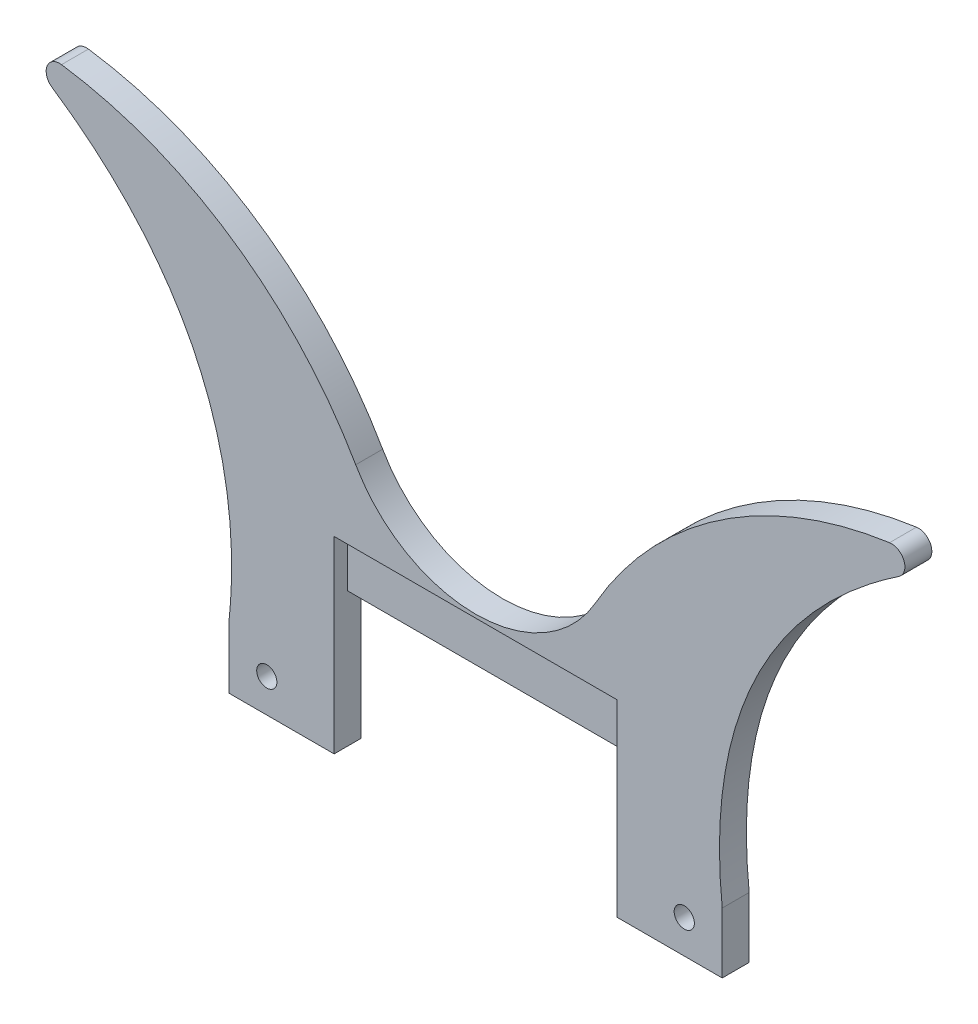
ISO-10303-21;
HEADER;
FILE_DESCRIPTION(('STEP AP214'),'2;1');
FILE_NAME('part.step','',(''),(''),'','','');
FILE_SCHEMA(('AUTOMOTIVE_DESIGN { 1 0 10303 214 1 1 1 1 }'));
ENDSEC;
DATA;
#1=APPLICATION_CONTEXT('core data for automotive mechanical design processes');
#2=APPLICATION_PROTOCOL_DEFINITION('international standard','automotive_design',2000,#1);
#3=PRODUCT_CONTEXT('',#1,'mechanical');
#4=PRODUCT('Part','Part','',(#3));
#5=PRODUCT_RELATED_PRODUCT_CATEGORY('part','',(#4));
#6=PRODUCT_DEFINITION_FORMATION('','',#4);
#7=PRODUCT_DEFINITION_CONTEXT('part definition',#1,'design');
#8=PRODUCT_DEFINITION('design','',#6,#7);
#9=PRODUCT_DEFINITION_SHAPE('','',#8);
#10=(LENGTH_UNIT() NAMED_UNIT(*) SI_UNIT(.MILLI.,.METRE.));
#11=(NAMED_UNIT(*) PLANE_ANGLE_UNIT() SI_UNIT($,.RADIAN.));
#12=(NAMED_UNIT(*) SI_UNIT($,.STERADIAN.) SOLID_ANGLE_UNIT());
#13=UNCERTAINTY_MEASURE_WITH_UNIT(LENGTH_MEASURE(1.E-05),#10,'distance_accuracy_value','');
#14=(GEOMETRIC_REPRESENTATION_CONTEXT(3) GLOBAL_UNCERTAINTY_ASSIGNED_CONTEXT((#13)) GLOBAL_UNIT_ASSIGNED_CONTEXT((#10,
#11,#12)) REPRESENTATION_CONTEXT('',''));
#15=CARTESIAN_POINT('',(0.,0.,0.));
#16=DIRECTION('',(0.,0.,1.));
#17=DIRECTION('',(1.,0.,0.));
#18=AXIS2_PLACEMENT_3D('',#15,#16,#17);
#19=CARTESIAN_POINT('',(21.,-29.,3.));
#20=DIRECTION('',(0.,1.,0.));
#21=DIRECTION('',(0.,0.,1.));
#22=AXIS2_PLACEMENT_3D('',#19,#20,#21);
#23=PLANE('',#22);
#24=DIRECTION('',(1.,0.,0.));
#25=VECTOR('',#24,1.);
#26=CARTESIAN_POINT('',(-21.,-29.,2.));
#27=LINE('',#26,#25);
#28=CARTESIAN_POINT('',(-21.,-29.,2.));
#29=VERTEX_POINT('',#28);
#30=CARTESIAN_POINT('',(21.,-29.,2.));
#31=VERTEX_POINT('',#30);
#32=EDGE_CURVE('E174',#29,#31,#27,.T.);
#33=ORIENTED_EDGE('',*,*,#32,.F.);
#34=DIRECTION('',(0.,0.,-1.));
#35=VECTOR('',#34,1.);
#36=CARTESIAN_POINT('',(-21.,-29.,3.));
#37=LINE('',#36,#35);
#38=CARTESIAN_POINT('',(-21.,-29.,0.));
#39=VERTEX_POINT('',#38);
#40=EDGE_CURVE('E171',#29,#39,#37,.T.);
#41=ORIENTED_EDGE('',*,*,#40,.T.);
#42=DIRECTION('',(1.,0.,0.));
#43=VECTOR('',#42,1.);
#44=CARTESIAN_POINT('',(21.,-29.,0.));
#45=LINE('',#44,#43);
#46=CARTESIAN_POINT('',(21.,-29.,0.));
#47=VERTEX_POINT('',#46);
#48=EDGE_CURVE('E354',#39,#47,#45,.T.);
#49=ORIENTED_EDGE('',*,*,#48,.T.);
#50=DIRECTION('',(0.,0.,-1.));
#51=VECTOR('',#50,1.);
#52=CARTESIAN_POINT('',(21.,-29.,3.));
#53=LINE('',#52,#51);
#54=EDGE_CURVE('E41',#31,#47,#53,.T.);
#55=ORIENTED_EDGE('',*,*,#54,.F.);
#56=EDGE_LOOP('',(#33,#41,#49,#55));
#57=FACE_BOUND('',#56,.T.);
#58=ADVANCED_FACE('F35',(#57),#23,.F.);
#59=CARTESIAN_POINT('',(-62.8789501729244,15.7957748257768,3.));
#60=CARTESIAN_POINT('',(-43.1395929849563,2.52766463737963,3.));
#61=CARTESIAN_POINT('',(-34.1215450972328,-16.7044066047716,3.));
#62=CARTESIAN_POINT('',(-36.6359205884375,-39.9745318361721,3.));
#63=B_SPLINE_CURVE_WITH_KNOTS('',3,(#59,#60,#61,#62),.UNSPECIFIED.,.F.,.F.,(4,4),(0.,
0.899908390048504),.UNSPECIFIED.);
#64=DIRECTION('',(0.,0.,-1.));
#65=VECTOR('',#64,1.);
#66=SURFACE_OF_LINEAR_EXTRUSION('',#63,#65);
#67=CARTESIAN_POINT('',(-62.8789501729244,15.7957748257768,0.));
#68=CARTESIAN_POINT('',(-43.1395929849563,2.52766463737963,0.));
#69=CARTESIAN_POINT('',(-34.1215450972328,-16.7044066047716,0.));
#70=CARTESIAN_POINT('',(-36.6359205884375,-39.9745318361721,0.));
#71=B_SPLINE_CURVE_WITH_KNOTS('',3,(#67,#68,#69,#70),.UNSPECIFIED.,.F.,.F.,(4,4),(0.,
0.899908390048504),.UNSPECIFIED.);
#72=CARTESIAN_POINT('',(-62.8789501729244,15.7957748257768,0.));
#73=VERTEX_POINT('',#72);
#74=CARTESIAN_POINT('',(-36.6359205884375,-39.9745318361721,0.));
#75=VERTEX_POINT('',#74);
#76=EDGE_CURVE('E310',#73,#75,#71,.T.);
#77=ORIENTED_EDGE('',*,*,#76,.T.);
#78=DIRECTION('',(0.,0.,-1.));
#79=VECTOR('',#78,1.);
#80=CARTESIAN_POINT('',(-36.6359205884375,-39.9745318361721,3.));
#81=LINE('',#80,#79);
#82=CARTESIAN_POINT('',(-36.6359205884375,-39.9745318361721,4.));
#83=VERTEX_POINT('',#82);
#84=EDGE_CURVE('E11',#83,#75,#81,.T.);
#85=ORIENTED_EDGE('',*,*,#84,.F.);
#86=CARTESIAN_POINT('',(-62.8789501983524,15.7957748428687,4.));
#87=CARTESIAN_POINT('',(-62.2992047153579,15.4060908624896,4.));
#88=CARTESIAN_POINT('',(-61.7247011820654,15.0085678996703,4.));
#89=CARTESIAN_POINT('',(-60.5863572690888,14.197069828261,4.));
#90=CARTESIAN_POINT('',(-60.0225310732882,13.7830748302125,4.));
#91=CARTESIAN_POINT('',(-58.9067497613757,12.9385098967699,4.));
#92=CARTESIAN_POINT('',(-58.3548039293089,12.5079276833045,4.));
#93=CARTESIAN_POINT('',(-57.2639786820871,11.6301095438679,4.));
#94=CARTESIAN_POINT('',(-56.7251040863667,11.1828676249731,4.));
#95=CARTESIAN_POINT('',(-55.6615856510737,10.2716850328772,4.));
#96=CARTESIAN_POINT('',(-55.136942827,9.80774317352995,4.));
#97=CARTESIAN_POINT('',(-54.1002857898766,8.86065395224623,4.));
#98=CARTESIAN_POINT('',(-53.5883509303149,8.3774196662437,4.));
#99=CARTESIAN_POINT('',(-52.5811482155379,7.39412188527395,4.));
#100=CARTESIAN_POINT('',(-52.0858761753551,6.89406268005182,4.));
#101=CARTESIAN_POINT('',(-51.1130819458684,5.87719780860403,4.));
#102=CARTESIAN_POINT('',(-50.6355553308735,5.36039637887713,4.));
#103=CARTESIAN_POINT('',(-49.699288198195,4.31016741537,4.));
#104=CARTESIAN_POINT('',(-49.240544980498,3.77674229070856,4.));
#105=CARTESIAN_POINT('',(-48.3428430793594,2.69344388811653,4.));
#106=CARTESIAN_POINT('',(-47.903885630509,2.14356958734303,4.));
#107=CARTESIAN_POINT('',(-46.9349167875511,0.882045796105658,4.));
#108=CARTESIAN_POINT('',(-46.4110629279017,0.16564947165594,4.));
#109=CARTESIAN_POINT('',(-45.3985077794996,-1.29178835244538,4.));
#110=CARTESIAN_POINT('',(-44.9098137511878,-2.03283489638598,4.));
#111=CARTESIAN_POINT('',(-43.9695336637035,-3.5381635301475,4.));
#112=CARTESIAN_POINT('',(-43.5179489543933,-4.30244646381471,4.));
#113=CARTESIAN_POINT('',(-42.653549136021,-5.85262541019528,4.));
#114=CARTESIAN_POINT('',(-42.2407335077328,-6.63852113327074,4.));
#115=CARTESIAN_POINT('',(-41.4566207304155,-8.22724888817084,4.));
#116=CARTESIAN_POINT('',(-41.0851796613498,-9.03000987917214,4.));
#117=CARTESIAN_POINT('',(-40.3831078266692,-10.6532082008548,4.));
#118=CARTESIAN_POINT('',(-40.0524781214374,-11.4736459901741,4.));
#119=CARTESIAN_POINT('',(-39.4327057047415,-13.1299768196811,4.));
#120=CARTESIAN_POINT('',(-39.1435603919995,-13.9658688870948,4.));
#121=CARTESIAN_POINT('',(-38.6070628595533,-15.6507681952899,4.));
#122=CARTESIAN_POINT('',(-38.3597019188835,-16.4997726588624,4.));
#123=CARTESIAN_POINT('',(-37.9403137285905,-18.0816850370489,4.));
#124=CARTESIAN_POINT('',(-37.7625538954137,-18.8130811001312,4.));
#125=CARTESIAN_POINT('',(-37.4369360785479,-20.282557797616,4.));
#126=CARTESIAN_POINT('',(-37.2890804373485,-21.020638950955,4.));
#127=CARTESIAN_POINT('',(-37.0228985260351,-22.5020090107033,4.));
#128=CARTESIAN_POINT('',(-36.9045685831705,-23.2452972575563,4.));
#129=CARTESIAN_POINT('',(-36.696846188067,-24.7359271716299,4.));
#130=CARTESIAN_POINT('',(-36.6074561715297,-25.4832691746518,4.));
#131=CARTESIAN_POINT('',(-36.381609041228,-27.7306742750706,4.));
#132=CARTESIAN_POINT('',(-36.2876412861376,-29.2351784920014,4.));
#133=CARTESIAN_POINT('',(-36.2064938502323,-32.2464275421835,4.));
#134=CARTESIAN_POINT('',(-36.2192865389033,-33.7531716947938,4.));
#135=CARTESIAN_POINT('',(-36.314292657224,-36.0465312373141,4.));
#136=CARTESIAN_POINT('',(-36.3605953895022,-36.8348165574061,4.));
#137=CARTESIAN_POINT('',(-36.4791458520079,-38.4073486103966,4.));
#138=CARTESIAN_POINT('',(-36.5513248235576,-39.1916005114055,4.));
#139=CARTESIAN_POINT('',(-36.6359205884375,-39.9745318361721,4.));
#140=B_SPLINE_CURVE_WITH_KNOTS('',3,(#86,#87,#88,#89,#90,#91,#92,#93,#94,#95,#96,#97,#98,#99,
#100,#101,#102,#103,#104,#105,#106,#107,#108,#109,#110,#111,#112,#113,#114,#115,#116,#117,#118,
#119,#120,#121,#122,#123,#124,#125,#126,#127,#128,#129,#130,#131,#132,#133,#134,#135,#136,#137,
#138,#139),.UNSPECIFIED.,.F.,.F.,(4,2,2,2,2,2,2,2,2,2,2,2,2,2,2,2,2,2,2,2,2,2,2,2,2,2,4),(0.,
2.0955903971612,4.19379288201894,6.29357950728328,8.39412891576521,10.4948278154304,
12.6063920340987,14.7174219003939,16.8279216954029,18.9381170445707,21.0484438838138,
23.7098775635535,26.3718592564134,29.033937736806,31.6959805594471,34.3484535906611,
37.0009955253802,39.6533710597453,42.3051923214926,44.5626394568548,46.8202633567307,
49.077606286863,51.3351391547758,55.8530551850305,60.3698019763224,62.7383537594367,
65.1006578862477),.UNSPECIFIED.);
#141=CARTESIAN_POINT('',(-62.8789501983524,15.7957748428687,4.));
#142=VERTEX_POINT('',#141);
#143=EDGE_CURVE('E216',#142,#83,#140,.T.);
#144=ORIENTED_EDGE('',*,*,#143,.F.);
#145=DIRECTION('',(0.,0.,-1.));
#146=VECTOR('',#145,1.);
#147=CARTESIAN_POINT('',(-62.8789501729244,15.7957748257768,3.));
#148=LINE('',#147,#146);
#149=EDGE_CURVE('E336',#142,#73,#148,.T.);
#150=ORIENTED_EDGE('',*,*,#149,.T.);
#151=EDGE_LOOP('',(#77,#85,#144,#150));
#152=FACE_BOUND('',#151,.T.);
#153=ADVANCED_FACE('F37',(#152),#66,.F.);
#154=CARTESIAN_POINT('',(36.6359205884375,-39.9745318361721,3.));
#155=CARTESIAN_POINT('',(34.1215450972952,-16.7044066048686,3.));
#156=CARTESIAN_POINT('',(43.1395929848827,2.52766463747982,3.));
#157=CARTESIAN_POINT('',(62.8789501729157,15.795774825771,3.));
#158=B_SPLINE_CURVE_WITH_KNOTS('',3,(#154,#155,#156,#157),.UNSPECIFIED.,.F.,.F.,(4,4),(0.,
0.899908390048373),.UNSPECIFIED.);
#159=DIRECTION('',(0.,0.,-1.));
#160=VECTOR('',#159,1.);
#161=SURFACE_OF_LINEAR_EXTRUSION('',#158,#160);
#162=CARTESIAN_POINT('',(36.6359205884375,-39.9745318361721,0.));
#163=CARTESIAN_POINT('',(34.1215450972952,-16.7044066048686,0.));
#164=CARTESIAN_POINT('',(43.1395929848827,2.52766463747982,0.));
#165=CARTESIAN_POINT('',(62.8789501729157,15.795774825771,0.));
#166=B_SPLINE_CURVE_WITH_KNOTS('',3,(#162,#163,#164,#165),.UNSPECIFIED.,.F.,.F.,(4,4),(0.,
0.899908390048373),.UNSPECIFIED.);
#167=CARTESIAN_POINT('',(36.6359205884375,-39.9745318361721,0.));
#168=VERTEX_POINT('',#167);
#169=CARTESIAN_POINT('',(62.8789501729157,15.795774825771,0.));
#170=VERTEX_POINT('',#169);
#171=EDGE_CURVE('E318',#168,#170,#166,.T.);
#172=ORIENTED_EDGE('',*,*,#171,.T.);
#173=DIRECTION('',(0.,0.,-1.));
#174=VECTOR('',#173,1.);
#175=CARTESIAN_POINT('',(62.8789501729157,15.795774825771,3.));
#176=LINE('',#175,#174);
#177=CARTESIAN_POINT('',(62.8789501729157,15.795774825771,4.));
#178=VERTEX_POINT('',#177);
#179=EDGE_CURVE('E348',#178,#170,#176,.T.);
#180=ORIENTED_EDGE('',*,*,#179,.F.);
#181=CARTESIAN_POINT('',(36.6359205884375,-39.9745318361721,4.));
#182=CARTESIAN_POINT('',(36.5629554677317,-39.2992680081986,4.));
#183=CARTESIAN_POINT('',(36.4992274072153,-38.622984757228,4.));
#184=CARTESIAN_POINT('',(36.3909092968743,-37.268111644364,4.));
#185=CARTESIAN_POINT('',(36.3463412320639,-36.58952002848,4.));
#186=CARTESIAN_POINT('',(36.2771535449611,-35.2308426823181,4.));
#187=CARTESIAN_POINT('',(36.2525476794966,-34.5507562449832,4.));
#188=CARTESIAN_POINT('',(36.2240477972191,-33.1899197372069,4.));
#189=CARTESIAN_POINT('',(36.2201605837493,-32.5091695221847,4.));
#190=CARTESIAN_POINT('',(36.2338124534101,-31.1478341500348,4.));
#191=CARTESIAN_POINT('',(36.2513528744646,-30.4672490058682,4.));
#192=CARTESIAN_POINT('',(36.3086330789313,-29.1044289893609,4.));
#193=CARTESIAN_POINT('',(36.3484565173289,-28.4221976042566,4.));
#194=CARTESIAN_POINT('',(36.450974517623,-27.0596091832346,4.));
#195=CARTESIAN_POINT('',(36.5136637026545,-26.3792517445243,4.));
#196=CARTESIAN_POINT('',(36.662461835899,-25.0212562526201,4.));
#197=CARTESIAN_POINT('',(36.7485653365755,-24.3436176040438,4.));
#198=CARTESIAN_POINT('',(36.9446781065149,-22.9918929547218,4.));
#199=CARTESIAN_POINT('',(37.0546841235846,-22.3178064834319,4.));
#200=CARTESIAN_POINT('',(37.2990161096672,-20.9740259848599,4.));
#201=CARTESIAN_POINT('',(37.4333432346668,-20.30433216793,4.));
#202=CARTESIAN_POINT('',(37.7647588733085,-18.7969158087323,4.));
#203=CARTESIAN_POINT('',(37.9690850441294,-17.9607717643407,4.));
#204=CARTESIAN_POINT('',(38.4172469084204,-16.2989697268659,4.));
#205=CARTESIAN_POINT('',(38.661090192519,-15.4733137813082,4.));
#206=CARTESIAN_POINT('',(39.188325846153,-13.8346768053953,4.));
#207=CARTESIAN_POINT('',(39.4717198439239,-13.0216962983989,4.));
#208=CARTESIAN_POINT('',(40.077770795431,-11.4105187580085,4.));
#209=CARTESIAN_POINT('',(40.4004269362143,-10.6123214189117,4.));
#210=CARTESIAN_POINT('',(41.0833561966707,-9.03508861246474,4.));
#211=CARTESIAN_POINT('',(41.4435110085324,-8.25600191939038,4.));
#212=CARTESIAN_POINT('',(42.2013426833512,-6.71628462680704,4.));
#213=CARTESIAN_POINT('',(42.5990201055576,-5.95565430259033,4.));
#214=CARTESIAN_POINT('',(43.4306677087596,-4.45455540809288,4.));
#215=CARTESIAN_POINT('',(43.8646362490711,-3.7140859283653,4.));
#216=CARTESIAN_POINT('',(44.7673509613336,-2.25483987274436,4.));
#217=CARTESIAN_POINT('',(45.2360910200989,-1.53605951479584,4.));
#218=CARTESIAN_POINT('',(46.1458149426853,-0.210076430628495,4.));
#219=CARTESIAN_POINT('',(46.5828991907427,0.39980813034508,4.));
#220=CARTESIAN_POINT('',(47.4812571689221,1.60156528035239,4.));
#221=CARTESIAN_POINT('',(47.9425328357944,2.1934364212297,4.));
#222=CARTESIAN_POINT('',(48.887911232869,3.35854117954806,4.));
#223=CARTESIAN_POINT('',(49.3720113367572,3.93177692852481,4.));
#224=CARTESIAN_POINT('',(50.3617788864925,5.05934372448881,4.));
#225=CARTESIAN_POINT('',(50.8674480718163,5.61367324023706,4.));
#226=CARTESIAN_POINT('',(52.4158427757139,7.24900549131061,4.));
#227=CARTESIAN_POINT('',(53.4891059446623,8.3013097336643,4.));
#228=CARTESIAN_POINT('',(55.7058085099433,10.3284097991378,4.));
#229=CARTESIAN_POINT('',(56.8492326864788,11.3032223276959,4.));
#230=CARTESIAN_POINT('',(58.4154263814602,12.5534933585002,4.));
#231=CARTESIAN_POINT('',(58.8115690166169,12.8627779773844,4.));
#232=CARTESIAN_POINT('',(59.6102224343737,13.472898404424,4.));
#233=CARTESIAN_POINT('',(60.012732116057,13.7737356487695,4.));
#234=CARTESIAN_POINT('',(60.8225353087744,14.3661469878053,4.));
#235=CARTESIAN_POINT('',(61.2298094952118,14.6577475388171,4.));
#236=CARTESIAN_POINT('',(62.0501379106521,15.2328332002011,4.));
#237=CARTESIAN_POINT('',(62.4631929782197,15.5163171146355,4.));
#238=CARTESIAN_POINT('',(62.8789501729157,15.795774825771,4.));
#239=B_SPLINE_CURVE_WITH_KNOTS('',3,(#181,#182,#183,#184,#185,#186,#187,#188,#189,#190,#191,
#192,#193,#194,#195,#196,#197,#198,#199,#200,#201,#202,#203,#204,#205,#206,#207,#208,#209,#210,
#211,#212,#213,#214,#215,#216,#217,#218,#219,#220,#221,#222,#223,#224,#225,#226,#227,#228,#229,
#230,#231,#232,#233,#234,#235,#236,#237,#238),.UNSPECIFIED.,.F.,.F.,(4,2,2,2,2,2,2,2,2,2,2,2,2,
2,2,2,2,2,2,2,2,2,2,2,2,2,2,2,4),(0.,2.03755132686895,4.07743442886864,6.11872211256235,
8.16068004860976,10.2027654893312,12.25256927456,14.3018913602204,16.3507370612891,
18.3993041693433,20.447968671737,23.0292252830187,25.6109783028819,28.1928376404816,
30.7746435277934,33.3485374407018,35.9224697218329,38.4962857009911,41.0696502447757,
43.3200505217677,45.5706312402864,47.8209536227543,50.071457830872,54.5764895089301,
59.0805473566836,60.5882167166257,62.0956281770586,63.5982375162388,65.1010671282741),.UNSPECIFIED.);
#240=CARTESIAN_POINT('',(36.6359205884375,-39.9745318361721,4.));
#241=VERTEX_POINT('',#240);
#242=EDGE_CURVE('E200',#241,#178,#239,.T.);
#243=ORIENTED_EDGE('',*,*,#242,.F.);
#244=DIRECTION('',(0.,0.,-1.));
#245=VECTOR('',#244,1.);
#246=CARTESIAN_POINT('',(36.6359205884375,-39.9745318361721,3.));
#247=LINE('',#246,#245);
#248=EDGE_CURVE('E47',#241,#168,#247,.T.);
#249=ORIENTED_EDGE('',*,*,#248,.T.);
#250=EDGE_LOOP('',(#172,#180,#243,#249));
#251=FACE_BOUND('',#250,.T.);
#252=ADVANCED_FACE('F296',(#251),#161,.F.);
#253=CARTESIAN_POINT('',(61.7632390949741,17.4556509628844,3.));
#254=DIRECTION('',(0.,0.,-1.));
#255=DIRECTION('',(-1.,0.,0.));
#256=AXIS2_PLACEMENT_3D('',#253,#254,#255);
#257=CYLINDRICAL_SURFACE('',#256,2.);
#258=CARTESIAN_POINT('',(61.7632390949741,17.4556509628844,0.));
#259=DIRECTION('',(0.,0.,1.));
#260=DIRECTION('',(1.,0.,0.));
#261=AXIS2_PLACEMENT_3D('',#258,#259,#260);
#262=CIRCLE('',#261,2.);
#263=CARTESIAN_POINT('',(61.4835796629155,19.4360020938863,0.));
#264=VERTEX_POINT('',#263);
#265=EDGE_CURVE('E325',#170,#264,#262,.T.);
#266=ORIENTED_EDGE('',*,*,#265,.T.);
#267=DIRECTION('',(0.,0.,-1.));
#268=VECTOR('',#267,1.);
#269=CARTESIAN_POINT('',(61.4835796629155,19.4360020938863,3.));
#270=LINE('',#269,#268);
#271=CARTESIAN_POINT('',(61.4835796629155,19.4360020938863,4.));
#272=VERTEX_POINT('',#271);
#273=EDGE_CURVE('E345',#272,#264,#270,.T.);
#274=ORIENTED_EDGE('',*,*,#273,.F.);
#275=CARTESIAN_POINT('',(61.7632390949741,17.4556509628844,4.));
#276=DIRECTION('',(0.,0.,1.));
#277=DIRECTION('',(1.,0.,0.));
#278=AXIS2_PLACEMENT_3D('',#275,#276,#277);
#279=CIRCLE('',#278,1.99999999999999);
#280=EDGE_CURVE('E201',#178,#272,#279,.T.);
#281=ORIENTED_EDGE('',*,*,#280,.F.);
#282=ORIENTED_EDGE('',*,*,#179,.T.);
#283=EDGE_LOOP('',(#266,#274,#281,#282));
#284=FACE_BOUND('',#283,.T.);
#285=ADVANCED_FACE('F293',(#284),#257,.T.);
#286=CARTESIAN_POINT('',(69.8733626246717,-39.9745318361721,3.));
#287=DIRECTION('',(0.,0.,-1.));
#288=DIRECTION('',(-1.,0.,0.));
#289=AXIS2_PLACEMENT_3D('',#286,#287,#288);
#290=CYLINDRICAL_SURFACE('',#289,60.);
#291=CARTESIAN_POINT('',(69.8733626246717,-39.9745318361721,0.));
#292=DIRECTION('',(0.,0.,1.));
#293=DIRECTION('',(1.,0.,0.));
#294=AXIS2_PLACEMENT_3D('',#291,#292,#293);
#295=CIRCLE('',#294,60.);
#296=CARTESIAN_POINT('',(17.7938376870282,-10.179849722255,0.));
#297=VERTEX_POINT('',#296);
#298=EDGE_CURVE('E330',#264,#297,#295,.T.);
#299=ORIENTED_EDGE('',*,*,#298,.T.);
#300=DIRECTION('',(0.,0.,-1.));
#301=VECTOR('',#300,1.);
#302=CARTESIAN_POINT('',(17.7938376870282,-10.179849722255,3.));
#303=LINE('',#302,#301);
#304=CARTESIAN_POINT('',(17.7938376870282,-10.179849722255,4.));
#305=VERTEX_POINT('',#304);
#306=EDGE_CURVE('E342',#305,#297,#303,.T.);
#307=ORIENTED_EDGE('',*,*,#306,.F.);
#308=CARTESIAN_POINT('',(69.8733626246717,-39.9745318361721,4.));
#309=DIRECTION('',(0.,0.,1.));
#310=DIRECTION('',(1.,0.,0.));
#311=AXIS2_PLACEMENT_3D('',#308,#309,#310);
#312=CIRCLE('',#311,60.);
#313=EDGE_CURVE('E204',#272,#305,#312,.T.);
#314=ORIENTED_EDGE('',*,*,#313,.F.);
#315=ORIENTED_EDGE('',*,*,#273,.T.);
#316=EDGE_LOOP('',(#299,#307,#314,#315));
#317=FACE_BOUND('',#316,.T.);
#318=ADVANCED_FACE('F289',(#317),#290,.T.);
#319=CARTESIAN_POINT('',(0.,0.,3.));
#320=DIRECTION('',(0.,0.,-1.));
#321=DIRECTION('',(-1.,0.,0.));
#322=AXIS2_PLACEMENT_3D('',#319,#320,#321);
#323=CYLINDRICAL_SURFACE('',#322,20.5);
#324=CARTESIAN_POINT('',(0.,0.,0.));
#325=DIRECTION('',(0.,0.,-1.));
#326=DIRECTION('',(1.,0.,0.));
#327=AXIS2_PLACEMENT_3D('',#324,#325,#326);
#328=CIRCLE('',#327,20.5);
#329=CARTESIAN_POINT('',(-17.7938376870282,-10.179849722255,0.));
#330=VERTEX_POINT('',#329);
#331=EDGE_CURVE('E332',#297,#330,#328,.T.);
#332=ORIENTED_EDGE('',*,*,#331,.T.);
#333=DIRECTION('',(0.,0.,-1.));
#334=VECTOR('',#333,1.);
#335=CARTESIAN_POINT('',(-17.7938376870282,-10.179849722255,3.));
#336=LINE('',#335,#334);
#337=CARTESIAN_POINT('',(-17.7938376870282,-10.179849722255,4.));
#338=VERTEX_POINT('',#337);
#339=EDGE_CURVE('E340',#338,#330,#336,.T.);
#340=ORIENTED_EDGE('',*,*,#339,.F.);
#341=CARTESIAN_POINT('',(0.,0.,4.));
#342=DIRECTION('',(0.,0.,-1.));
#343=DIRECTION('',(1.,0.,0.));
#344=AXIS2_PLACEMENT_3D('',#341,#342,#343);
#345=CIRCLE('',#344,20.5);
#346=EDGE_CURVE('E207',#305,#338,#345,.T.);
#347=ORIENTED_EDGE('',*,*,#346,.F.);
#348=ORIENTED_EDGE('',*,*,#306,.T.);
#349=EDGE_LOOP('',(#332,#340,#347,#348));
#350=FACE_BOUND('',#349,.T.);
#351=ADVANCED_FACE('F286',(#350),#323,.F.);
#352=CARTESIAN_POINT('',(-69.8733626246717,-39.9745318361721,3.));
#353=DIRECTION('',(0.,0.,-1.));
#354=DIRECTION('',(-1.,0.,0.));
#355=AXIS2_PLACEMENT_3D('',#352,#353,#354);
#356=CYLINDRICAL_SURFACE('',#355,60.);
#357=CARTESIAN_POINT('',(-69.8733626246717,-39.9745318361721,0.));
#358=DIRECTION('',(0.,0.,1.));
#359=DIRECTION('',(-1.,0.,0.));
#360=AXIS2_PLACEMENT_3D('',#357,#358,#359);
#361=CIRCLE('',#360,60.);
#362=CARTESIAN_POINT('',(-61.4835796629155,19.4360020938863,0.));
#363=VERTEX_POINT('',#362);
#364=EDGE_CURVE('E63',#330,#363,#361,.T.);
#365=ORIENTED_EDGE('',*,*,#364,.T.);
#366=DIRECTION('',(0.,0.,-1.));
#367=VECTOR('',#366,1.);
#368=CARTESIAN_POINT('',(-61.4835796629155,19.4360020938863,3.));
#369=LINE('',#368,#367);
#370=CARTESIAN_POINT('',(-61.4835796629155,19.4360020938863,4.));
#371=VERTEX_POINT('',#370);
#372=EDGE_CURVE('E338',#371,#363,#369,.T.);
#373=ORIENTED_EDGE('',*,*,#372,.F.);
#374=CARTESIAN_POINT('',(-69.8733626246717,-39.9745318361721,4.));
#375=DIRECTION('',(0.,0.,1.));
#376=DIRECTION('',(1.,0.,0.));
#377=AXIS2_PLACEMENT_3D('',#374,#375,#376);
#378=CIRCLE('',#377,60.);
#379=EDGE_CURVE('E210',#338,#371,#378,.T.);
#380=ORIENTED_EDGE('',*,*,#379,.F.);
#381=ORIENTED_EDGE('',*,*,#339,.T.);
#382=EDGE_LOOP('',(#365,#373,#380,#381));
#383=FACE_BOUND('',#382,.T.);
#384=ADVANCED_FACE('F283',(#383),#356,.T.);
#385=CARTESIAN_POINT('',(-61.7632390949741,17.4556509628844,3.));
#386=DIRECTION('',(0.,0.,-1.));
#387=DIRECTION('',(-1.,0.,0.));
#388=AXIS2_PLACEMENT_3D('',#385,#386,#387);
#389=CYLINDRICAL_SURFACE('',#388,2.);
#390=CARTESIAN_POINT('',(-61.7632390949741,17.4556509628844,0.));
#391=DIRECTION('',(0.,0.,1.));
#392=DIRECTION('',(-1.,0.,0.));
#393=AXIS2_PLACEMENT_3D('',#390,#391,#392);
#394=CIRCLE('',#393,2.);
#395=EDGE_CURVE('E55',#363,#73,#394,.T.);
#396=ORIENTED_EDGE('',*,*,#395,.T.);
#397=ORIENTED_EDGE('',*,*,#149,.F.);
#398=CARTESIAN_POINT('',(-61.7632390949741,17.4556509628844,4.));
#399=DIRECTION('',(0.,0.,1.));
#400=DIRECTION('',(1.,0.,0.));
#401=AXIS2_PLACEMENT_3D('',#398,#399,#400);
#402=CIRCLE('',#401,1.99999999999999);
#403=EDGE_CURVE('E213',#371,#142,#402,.T.);
#404=ORIENTED_EDGE('',*,*,#403,.F.);
#405=ORIENTED_EDGE('',*,*,#372,.T.);
#406=EDGE_LOOP('',(#396,#397,#404,#405));
#407=FACE_BOUND('',#406,.T.);
#408=ADVANCED_FACE('F279',(#407),#389,.T.);
#409=CARTESIAN_POINT('',(-41.4122856259911,-8.33862286407141,0.));
#410=DIRECTION('',(0.,0.,-1.));
#411=DIRECTION('',(-1.,0.,0.));
#412=AXIS2_PLACEMENT_3D('',#409,#410,#411);
#413=PLANE('',#412);
#414=DIRECTION('',(0.,-1.,0.));
#415=VECTOR('',#414,1.);
#416=CARTESIAN_POINT('',(21.,-29.,0.));
#417=LINE('',#416,#415);
#418=CARTESIAN_POINT('',(21.,-48.9745318361721,0.));
#419=VERTEX_POINT('',#418);
#420=EDGE_CURVE('E360',#47,#419,#417,.T.);
#421=ORIENTED_EDGE('',*,*,#420,.F.);
#422=ORIENTED_EDGE('',*,*,#48,.F.);
#423=DIRECTION('',(0.,1.,0.));
#424=VECTOR('',#423,1.);
#425=CARTESIAN_POINT('',(-21.,-29.,0.));
#426=LINE('',#425,#424);
#427=CARTESIAN_POINT('',(-21.,-48.9745318361721,0.));
#428=VERTEX_POINT('',#427);
#429=EDGE_CURVE('E356',#428,#39,#426,.T.);
#430=ORIENTED_EDGE('',*,*,#429,.F.);
#431=DIRECTION('',(-1.,0.,0.));
#432=VECTOR('',#431,1.);
#433=CARTESIAN_POINT('',(-36.6359205884375,-48.9745318361721,0.));
#434=LINE('',#433,#432);
#435=CARTESIAN_POINT('',(-36.6359205884375,-48.9745318361721,0.));
#436=VERTEX_POINT('',#435);
#437=EDGE_CURVE('E386',#428,#436,#434,.T.);
#438=ORIENTED_EDGE('',*,*,#437,.T.);
#439=DIRECTION('',(0.,1.,0.));
#440=VECTOR('',#439,1.);
#441=CARTESIAN_POINT('',(-36.6359205884375,-39.9745318361721,0.));
#442=LINE('',#441,#440);
#443=EDGE_CURVE('E382',#436,#75,#442,.T.);
#444=ORIENTED_EDGE('',*,*,#443,.T.);
#445=ORIENTED_EDGE('',*,*,#76,.F.);
#446=ORIENTED_EDGE('',*,*,#395,.F.);
#447=ORIENTED_EDGE('',*,*,#364,.F.);
#448=ORIENTED_EDGE('',*,*,#331,.F.);
#449=ORIENTED_EDGE('',*,*,#298,.F.);
#450=ORIENTED_EDGE('',*,*,#265,.F.);
#451=ORIENTED_EDGE('',*,*,#171,.F.);
#452=DIRECTION('',(0.,-1.,0.));
#453=VECTOR('',#452,1.);
#454=CARTESIAN_POINT('',(36.6359205884375,-39.9745318361721,0.));
#455=LINE('',#454,#453);
#456=CARTESIAN_POINT('',(36.6359205884375,-48.9745318361721,0.));
#457=VERTEX_POINT('',#456);
#458=EDGE_CURVE('E372',#168,#457,#455,.T.);
#459=ORIENTED_EDGE('',*,*,#458,.T.);
#460=DIRECTION('',(-1.,0.,0.));
#461=VECTOR('',#460,1.);
#462=CARTESIAN_POINT('',(36.6359205884375,-48.9745318361721,0.));
#463=LINE('',#462,#461);
#464=EDGE_CURVE('E367',#457,#419,#463,.T.);
#465=ORIENTED_EDGE('',*,*,#464,.T.);
#466=EDGE_LOOP('',(#421,#422,#430,#438,#444,#445,#446,#447,#448,#449,#450,#451,#459,#465));
#467=FACE_BOUND('',#466,.T.);
#468=CARTESIAN_POINT('',(31.,-44.,0.));
#469=DIRECTION('',(0.,0.,-1.));
#470=DIRECTION('',(-1.,0.,0.));
#471=AXIS2_PLACEMENT_3D('',#468,#469,#470);
#472=CIRCLE('',#471,1.5);
#473=CARTESIAN_POINT('',(29.5,-44.,0.));
#474=VERTEX_POINT('',#473);
#475=EDGE_CURVE('E375',#474,#474,#472,.T.);
#476=ORIENTED_EDGE('',*,*,#475,.F.);
#477=EDGE_LOOP('',(#476));
#478=FACE_BOUND('',#477,.T.);
#479=CARTESIAN_POINT('',(-31.,-44.,0.));
#480=DIRECTION('',(0.,0.,-1.));
#481=DIRECTION('',(1.,0.,0.));
#482=AXIS2_PLACEMENT_3D('',#479,#480,#481);
#483=CIRCLE('',#482,1.5);
#484=CARTESIAN_POINT('',(-29.5,-44.,0.));
#485=VERTEX_POINT('',#484);
#486=EDGE_CURVE('E164',#485,#485,#483,.T.);
#487=ORIENTED_EDGE('',*,*,#486,.F.);
#488=EDGE_LOOP('',(#487));
#489=FACE_BOUND('',#488,.T.);
#490=ADVANCED_FACE('F275',(#467,#478,#489),#413,.T.);
#491=CARTESIAN_POINT('',(21.,-29.,3.));
#492=DIRECTION('',(1.,0.,0.));
#493=DIRECTION('',(0.,0.,-1.));
#494=AXIS2_PLACEMENT_3D('',#491,#492,#493);
#495=PLANE('',#494);
#496=ORIENTED_EDGE('',*,*,#420,.T.);
#497=DIRECTION('',(0.,0.,-1.));
#498=VECTOR('',#497,1.);
#499=CARTESIAN_POINT('',(21.,-48.9745318361721,3.));
#500=LINE('',#499,#498);
#501=CARTESIAN_POINT('',(21.,-48.9745318361721,4.));
#502=VERTEX_POINT('',#501);
#503=EDGE_CURVE('E364',#502,#419,#500,.T.);
#504=ORIENTED_EDGE('',*,*,#503,.F.);
#505=DIRECTION('',(0.,-1.,0.));
#506=VECTOR('',#505,1.);
#507=CARTESIAN_POINT('',(21.,-29.,4.));
#508=LINE('',#507,#506);
#509=CARTESIAN_POINT('',(21.,-21.,4.));
#510=VERTEX_POINT('',#509);
#511=EDGE_CURVE('E191',#510,#502,#508,.T.);
#512=ORIENTED_EDGE('',*,*,#511,.F.);
#513=DIRECTION('',(0.,0.,-1.));
#514=VECTOR('',#513,1.);
#515=CARTESIAN_POINT('',(21.,-21.,4.));
#516=LINE('',#515,#514);
#517=CARTESIAN_POINT('',(21.,-21.,2.));
#518=VERTEX_POINT('',#517);
#519=EDGE_CURVE('E165',#510,#518,#516,.T.);
#520=ORIENTED_EDGE('',*,*,#519,.T.);
#521=DIRECTION('',(0.,1.,0.));
#522=VECTOR('',#521,1.);
#523=CARTESIAN_POINT('',(21.,-29.,2.));
#524=LINE('',#523,#522);
#525=EDGE_CURVE('E178',#31,#518,#524,.T.);
#526=ORIENTED_EDGE('',*,*,#525,.F.);
#527=ORIENTED_EDGE('',*,*,#54,.T.);
#528=EDGE_LOOP('',(#496,#504,#512,#520,#526,#527));
#529=FACE_BOUND('',#528,.T.);
#530=ADVANCED_FACE('F272',(#529),#495,.F.);
#531=CARTESIAN_POINT('',(-21.,-29.,3.));
#532=DIRECTION('',(-1.,0.,0.));
#533=DIRECTION('',(0.,0.,1.));
#534=AXIS2_PLACEMENT_3D('',#531,#532,#533);
#535=PLANE('',#534);
#536=ORIENTED_EDGE('',*,*,#40,.F.);
#537=DIRECTION('',(0.,-1.,0.));
#538=VECTOR('',#537,1.);
#539=CARTESIAN_POINT('',(-21.,-21.,2.));
#540=LINE('',#539,#538);
#541=CARTESIAN_POINT('',(-21.,-21.,2.));
#542=VERTEX_POINT('',#541);
#543=EDGE_CURVE('E168',#542,#29,#540,.T.);
#544=ORIENTED_EDGE('',*,*,#543,.F.);
#545=DIRECTION('',(0.,0.,-1.));
#546=VECTOR('',#545,1.);
#547=CARTESIAN_POINT('',(-21.,-21.,4.));
#548=LINE('',#547,#546);
#549=CARTESIAN_POINT('',(-21.,-21.,4.));
#550=VERTEX_POINT('',#549);
#551=EDGE_CURVE('E154',#550,#542,#548,.T.);
#552=ORIENTED_EDGE('',*,*,#551,.F.);
#553=DIRECTION('',(0.,1.,0.));
#554=VECTOR('',#553,1.);
#555=CARTESIAN_POINT('',(-21.,-48.9745318361721,4.));
#556=LINE('',#555,#554);
#557=CARTESIAN_POINT('',(-21.,-48.9745318361721,4.));
#558=VERTEX_POINT('',#557);
#559=EDGE_CURVE('E188',#558,#550,#556,.T.);
#560=ORIENTED_EDGE('',*,*,#559,.F.);
#561=DIRECTION('',(0.,0.,-1.));
#562=VECTOR('',#561,1.);
#563=CARTESIAN_POINT('',(-21.,-48.9745318361721,3.));
#564=LINE('',#563,#562);
#565=EDGE_CURVE('E379',#558,#428,#564,.T.);
#566=ORIENTED_EDGE('',*,*,#565,.T.);
#567=ORIENTED_EDGE('',*,*,#429,.T.);
#568=EDGE_LOOP('',(#536,#544,#552,#560,#566,#567));
#569=FACE_BOUND('',#568,.T.);
#570=ADVANCED_FACE('F169',(#569),#535,.F.);
#571=CARTESIAN_POINT('',(36.6359205884375,-39.9745318361721,3.));
#572=DIRECTION('',(1.,0.,0.));
#573=DIRECTION('',(0.,0.,-1.));
#574=AXIS2_PLACEMENT_3D('',#571,#572,#573);
#575=PLANE('',#574);
#576=ORIENTED_EDGE('',*,*,#458,.F.);
#577=ORIENTED_EDGE('',*,*,#248,.F.);
#578=DIRECTION('',(0.,1.,0.));
#579=VECTOR('',#578,1.);
#580=CARTESIAN_POINT('',(36.6359205884375,-48.9745318361721,4.));
#581=LINE('',#580,#579);
#582=CARTESIAN_POINT('',(36.6359205884375,-48.9745318361721,4.));
#583=VERTEX_POINT('',#582);
#584=EDGE_CURVE('E197',#583,#241,#581,.T.);
#585=ORIENTED_EDGE('',*,*,#584,.F.);
#586=DIRECTION('',(0.,0.,-1.));
#587=VECTOR('',#586,1.);
#588=CARTESIAN_POINT('',(36.6359205884375,-48.9745318361721,3.));
#589=LINE('',#588,#587);
#590=EDGE_CURVE('E365',#583,#457,#589,.T.);
#591=ORIENTED_EDGE('',*,*,#590,.T.);
#592=EDGE_LOOP('',(#576,#577,#585,#591));
#593=FACE_BOUND('',#592,.T.);
#594=ADVANCED_FACE('F262',(#593),#575,.T.);
#595=CARTESIAN_POINT('',(36.6359205884375,-48.9745318361721,3.));
#596=DIRECTION('',(0.,-1.,0.));
#597=DIRECTION('',(0.,0.,-1.));
#598=AXIS2_PLACEMENT_3D('',#595,#596,#597);
#599=PLANE('',#598);
#600=ORIENTED_EDGE('',*,*,#464,.F.);
#601=ORIENTED_EDGE('',*,*,#590,.F.);
#602=DIRECTION('',(1.,0.,0.));
#603=VECTOR('',#602,1.);
#604=CARTESIAN_POINT('',(21.,-48.9745318361721,4.));
#605=LINE('',#604,#603);
#606=EDGE_CURVE('E194',#502,#583,#605,.T.);
#607=ORIENTED_EDGE('',*,*,#606,.F.);
#608=ORIENTED_EDGE('',*,*,#503,.T.);
#609=EDGE_LOOP('',(#600,#601,#607,#608));
#610=FACE_BOUND('',#609,.T.);
#611=ADVANCED_FACE('F258',(#610),#599,.T.);
#612=CARTESIAN_POINT('',(31.,-44.,3.));
#613=DIRECTION('',(0.,0.,-1.));
#614=DIRECTION('',(-1.,0.,0.));
#615=AXIS2_PLACEMENT_3D('',#612,#613,#614);
#616=CYLINDRICAL_SURFACE('',#615,1.5);
#617=ORIENTED_EDGE('',*,*,#475,.T.);
#618=EDGE_LOOP('',(#617));
#619=FACE_BOUND('',#618,.T.);
#620=CARTESIAN_POINT('',(31.,-44.,4.));
#621=DIRECTION('',(0.,0.,-1.));
#622=DIRECTION('',(-1.,0.,0.));
#623=AXIS2_PLACEMENT_3D('',#620,#621,#622);
#624=CIRCLE('',#623,1.5);
#625=CARTESIAN_POINT('',(29.5,-44.,4.));
#626=VERTEX_POINT('',#625);
#627=EDGE_CURVE('E179',#626,#626,#624,.T.);
#628=ORIENTED_EDGE('',*,*,#627,.F.);
#629=EDGE_LOOP('',(#628));
#630=FACE_BOUND('',#629,.T.);
#631=ADVANCED_FACE('F251',(#619,#630),#616,.F.);
#632=CARTESIAN_POINT('',(-36.6359205884375,-39.9745318361721,3.));
#633=DIRECTION('',(-1.,0.,0.));
#634=DIRECTION('',(0.,0.,1.));
#635=AXIS2_PLACEMENT_3D('',#632,#633,#634);
#636=PLANE('',#635);
#637=ORIENTED_EDGE('',*,*,#443,.F.);
#638=DIRECTION('',(0.,0.,-1.));
#639=VECTOR('',#638,1.);
#640=CARTESIAN_POINT('',(-36.6359205884375,-48.9745318361721,3.));
#641=LINE('',#640,#639);
#642=CARTESIAN_POINT('',(-36.6359205884375,-48.9745318361721,4.));
#643=VERTEX_POINT('',#642);
#644=EDGE_CURVE('E378',#643,#436,#641,.T.);
#645=ORIENTED_EDGE('',*,*,#644,.F.);
#646=DIRECTION('',(0.,-1.,0.));
#647=VECTOR('',#646,1.);
#648=CARTESIAN_POINT('',(-36.6359205884375,-39.9745318361721,4.));
#649=LINE('',#648,#647);
#650=EDGE_CURVE('E217',#83,#643,#649,.T.);
#651=ORIENTED_EDGE('',*,*,#650,.F.);
#652=ORIENTED_EDGE('',*,*,#84,.T.);
#653=EDGE_LOOP('',(#637,#645,#651,#652));
#654=FACE_BOUND('',#653,.T.);
#655=ADVANCED_FACE('F248',(#654),#636,.T.);
#656=CARTESIAN_POINT('',(-36.6359205884375,-48.9745318361721,3.));
#657=DIRECTION('',(0.,-1.,0.));
#658=DIRECTION('',(0.,0.,-1.));
#659=AXIS2_PLACEMENT_3D('',#656,#657,#658);
#660=PLANE('',#659);
#661=ORIENTED_EDGE('',*,*,#437,.F.);
#662=ORIENTED_EDGE('',*,*,#565,.F.);
#663=DIRECTION('',(1.,0.,0.));
#664=VECTOR('',#663,1.);
#665=CARTESIAN_POINT('',(-36.6359205884375,-48.9745318361721,4.));
#666=LINE('',#665,#664);
#667=EDGE_CURVE('E220',#643,#558,#666,.T.);
#668=ORIENTED_EDGE('',*,*,#667,.F.);
#669=ORIENTED_EDGE('',*,*,#644,.T.);
#670=EDGE_LOOP('',(#661,#662,#668,#669));
#671=FACE_BOUND('',#670,.T.);
#672=ADVANCED_FACE('F246',(#671),#660,.T.);
#673=CARTESIAN_POINT('',(-31.,-44.,3.));
#674=DIRECTION('',(0.,0.,-1.));
#675=DIRECTION('',(-1.,0.,0.));
#676=AXIS2_PLACEMENT_3D('',#673,#674,#675);
#677=CYLINDRICAL_SURFACE('',#676,1.5);
#678=ORIENTED_EDGE('',*,*,#486,.T.);
#679=EDGE_LOOP('',(#678));
#680=FACE_BOUND('',#679,.T.);
#681=CARTESIAN_POINT('',(-31.,-44.,4.));
#682=DIRECTION('',(0.,0.,-1.));
#683=DIRECTION('',(-1.,0.,0.));
#684=AXIS2_PLACEMENT_3D('',#681,#682,#683);
#685=CIRCLE('',#684,1.5);
#686=CARTESIAN_POINT('',(-32.5,-44.,4.));
#687=VERTEX_POINT('',#686);
#688=EDGE_CURVE('E182',#687,#687,#685,.T.);
#689=ORIENTED_EDGE('',*,*,#688,.F.);
#690=EDGE_LOOP('',(#689));
#691=FACE_BOUND('',#690,.T.);
#692=ADVANCED_FACE('F239',(#680,#691),#677,.F.);
#693=CARTESIAN_POINT('',(41.4122856259859,-8.33862286407093,4.));
#694=DIRECTION('',(0.,0.,1.));
#695=DIRECTION('',(1.,0.,0.));
#696=AXIS2_PLACEMENT_3D('',#693,#694,#695);
#697=PLANE('',#696);
#698=ORIENTED_EDGE('',*,*,#688,.T.);
#699=EDGE_LOOP('',(#698));
#700=FACE_BOUND('',#699,.T.);
#701=ORIENTED_EDGE('',*,*,#627,.T.);
#702=EDGE_LOOP('',(#701));
#703=FACE_BOUND('',#702,.T.);
#704=ORIENTED_EDGE('',*,*,#559,.T.);
#705=DIRECTION('',(1.,0.,0.));
#706=VECTOR('',#705,1.);
#707=CARTESIAN_POINT('',(-21.,-21.,4.));
#708=LINE('',#707,#706);
#709=EDGE_CURVE('E161',#550,#510,#708,.T.);
#710=ORIENTED_EDGE('',*,*,#709,.T.);
#711=ORIENTED_EDGE('',*,*,#511,.T.);
#712=ORIENTED_EDGE('',*,*,#606,.T.);
#713=ORIENTED_EDGE('',*,*,#584,.T.);
#714=ORIENTED_EDGE('',*,*,#242,.T.);
#715=ORIENTED_EDGE('',*,*,#280,.T.);
#716=ORIENTED_EDGE('',*,*,#313,.T.);
#717=ORIENTED_EDGE('',*,*,#346,.T.);
#718=ORIENTED_EDGE('',*,*,#379,.T.);
#719=ORIENTED_EDGE('',*,*,#403,.T.);
#720=ORIENTED_EDGE('',*,*,#143,.T.);
#721=ORIENTED_EDGE('',*,*,#650,.T.);
#722=ORIENTED_EDGE('',*,*,#667,.T.);
#723=EDGE_LOOP('',(#704,#710,#711,#712,#713,#714,#715,#716,#717,#718,#719,#720,#721,#722));
#724=FACE_BOUND('',#723,.T.);
#725=ADVANCED_FACE('F234',(#700,#703,#724),#697,.T.);
#726=CARTESIAN_POINT('',(-21.,-21.,4.));
#727=DIRECTION('',(0.,1.,0.));
#728=DIRECTION('',(0.,0.,1.));
#729=AXIS2_PLACEMENT_3D('',#726,#727,#728);
#730=PLANE('',#729);
#731=ORIENTED_EDGE('',*,*,#551,.T.);
#732=DIRECTION('',(-1.,0.,0.));
#733=VECTOR('',#732,1.);
#734=CARTESIAN_POINT('',(21.,-21.,2.));
#735=LINE('',#734,#733);
#736=EDGE_CURVE('E159',#518,#542,#735,.T.);
#737=ORIENTED_EDGE('',*,*,#736,.F.);
#738=ORIENTED_EDGE('',*,*,#519,.F.);
#739=ORIENTED_EDGE('',*,*,#709,.F.);
#740=EDGE_LOOP('',(#731,#737,#738,#739));
#741=FACE_BOUND('',#740,.T.);
#742=ADVANCED_FACE('F156',(#741),#730,.F.);
#743=CARTESIAN_POINT('',(0.,0.,2.));
#744=DIRECTION('',(0.,0.,1.));
#745=DIRECTION('',(1.,0.,0.));
#746=AXIS2_PLACEMENT_3D('',#743,#744,#745);
#747=PLANE('',#746);
#748=ORIENTED_EDGE('',*,*,#736,.T.);
#749=ORIENTED_EDGE('',*,*,#543,.T.);
#750=ORIENTED_EDGE('',*,*,#32,.T.);
#751=ORIENTED_EDGE('',*,*,#525,.T.);
#752=EDGE_LOOP('',(#748,#749,#750,#751));
#753=FACE_BOUND('',#752,.T.);
#754=ADVANCED_FACE('F176',(#753),#747,.T.);
#755=CLOSED_SHELL('',(#58,#153,#252,#285,#318,#351,#384,#408,#490,#530,#570,#594,#611,#631,#655,
#672,#692,#725,#742,#754));
#756=MANIFOLD_SOLID_BREP('B2',#755);
#757=ADVANCED_BREP_SHAPE_REPRESENTATION('',(#18,#756),#14);
#758=SHAPE_DEFINITION_REPRESENTATION(#9,#757);
ENDSEC;
END-ISO-10303-21;
